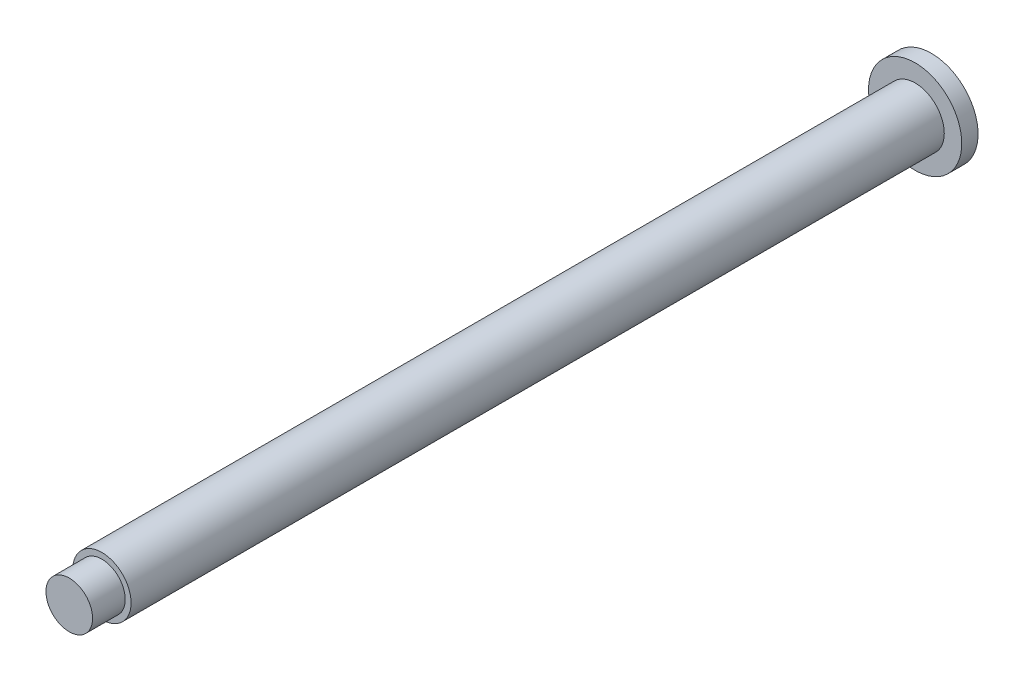
ISO-10303-21;
HEADER;
FILE_DESCRIPTION(('STEP AP214'),'2;1');
FILE_NAME('part.step','',(''),(''),'','','');
FILE_SCHEMA(('AUTOMOTIVE_DESIGN { 1 0 10303 214 1 1 1 1 }'));
ENDSEC;
DATA;
#1=APPLICATION_CONTEXT('core data for automotive mechanical design processes');
#2=APPLICATION_PROTOCOL_DEFINITION('international standard','automotive_design',2000,#1);
#3=PRODUCT_CONTEXT('',#1,'mechanical');
#4=PRODUCT('Part','Part','',(#3));
#5=PRODUCT_RELATED_PRODUCT_CATEGORY('part','',(#4));
#6=PRODUCT_DEFINITION_FORMATION('','',#4);
#7=PRODUCT_DEFINITION_CONTEXT('part definition',#1,'design');
#8=PRODUCT_DEFINITION('design','',#6,#7);
#9=PRODUCT_DEFINITION_SHAPE('','',#8);
#10=(LENGTH_UNIT() NAMED_UNIT(*) SI_UNIT(.MILLI.,.METRE.));
#11=(NAMED_UNIT(*) PLANE_ANGLE_UNIT() SI_UNIT($,.RADIAN.));
#12=(NAMED_UNIT(*) SI_UNIT($,.STERADIAN.) SOLID_ANGLE_UNIT());
#13=UNCERTAINTY_MEASURE_WITH_UNIT(LENGTH_MEASURE(1.E-05),#10,'distance_accuracy_value','');
#14=(GEOMETRIC_REPRESENTATION_CONTEXT(3) GLOBAL_UNCERTAINTY_ASSIGNED_CONTEXT((#13)) GLOBAL_UNIT_ASSIGNED_CONTEXT((#10,
#11,#12)) REPRESENTATION_CONTEXT('',''));
#15=CARTESIAN_POINT('',(0.,0.,0.));
#16=DIRECTION('',(0.,0.,1.));
#17=DIRECTION('',(1.,0.,0.));
#18=AXIS2_PLACEMENT_3D('',#15,#16,#17);
#19=CARTESIAN_POINT('',(0.,0.,69.75));
#20=DIRECTION('',(0.,0.,-1.));
#21=DIRECTION('',(-1.,0.,0.));
#22=AXIS2_PLACEMENT_3D('',#19,#20,#21);
#23=CYLINDRICAL_SURFACE('',#22,2.5);
#24=CARTESIAN_POINT('',(0.,0.,69.75));
#25=DIRECTION('',(0.,0.,1.));
#26=DIRECTION('',(1.,0.,0.));
#27=AXIS2_PLACEMENT_3D('',#24,#25,#26);
#28=CIRCLE('',#27,2.5);
#29=CARTESIAN_POINT('',(2.5,0.,69.75));
#30=VERTEX_POINT('',#29);
#31=EDGE_CURVE('E46',#30,#30,#28,.T.);
#32=ORIENTED_EDGE('',*,*,#31,.F.);
#33=EDGE_LOOP('',(#32));
#34=FACE_BOUND('',#33,.T.);
#35=CARTESIAN_POINT('',(0.,0.,0.));
#36=DIRECTION('',(0.,0.,1.));
#37=DIRECTION('',(1.,0.,0.));
#38=AXIS2_PLACEMENT_3D('',#35,#36,#37);
#39=CIRCLE('',#38,2.5);
#40=CARTESIAN_POINT('',(2.5,0.,0.));
#41=VERTEX_POINT('',#40);
#42=EDGE_CURVE('E42',#41,#41,#39,.T.);
#43=ORIENTED_EDGE('',*,*,#42,.T.);
#44=EDGE_LOOP('',(#43));
#45=FACE_BOUND('',#44,.T.);
#46=ADVANCED_FACE('F39',(#34,#45),#23,.T.);
#47=CARTESIAN_POINT('',(0.,0.,69.75));
#48=DIRECTION('',(0.,0.,1.));
#49=DIRECTION('',(1.,0.,0.));
#50=AXIS2_PLACEMENT_3D('',#47,#48,#49);
#51=PLANE('',#50);
#52=CARTESIAN_POINT('',(0.,0.,69.75));
#53=DIRECTION('',(0.,0.,1.));
#54=DIRECTION('',(1.,0.,0.));
#55=AXIS2_PLACEMENT_3D('',#52,#53,#54);
#56=CIRCLE('',#55,2.);
#57=CARTESIAN_POINT('',(2.,0.,69.75));
#58=VERTEX_POINT('',#57);
#59=EDGE_CURVE('E10',#58,#58,#56,.T.);
#60=ORIENTED_EDGE('',*,*,#59,.F.);
#61=EDGE_LOOP('',(#60));
#62=FACE_BOUND('',#61,.T.);
#63=ORIENTED_EDGE('',*,*,#31,.T.);
#64=EDGE_LOOP('',(#63));
#65=FACE_BOUND('',#64,.T.);
#66=ADVANCED_FACE('F88',(#62,#65),#51,.T.);
#67=CARTESIAN_POINT('',(0.,0.,-1.4));
#68=DIRECTION('',(0.,0.,1.));
#69=DIRECTION('',(1.,0.,0.));
#70=AXIS2_PLACEMENT_3D('',#67,#68,#69);
#71=CYLINDRICAL_SURFACE('',#70,4.);
#72=CARTESIAN_POINT('',(0.,0.,-1.4));
#73=DIRECTION('',(0.,0.,-1.));
#74=DIRECTION('',(-1.,0.,0.));
#75=AXIS2_PLACEMENT_3D('',#72,#73,#74);
#76=CIRCLE('',#75,4.);
#77=CARTESIAN_POINT('',(-4.,0.,-1.4));
#78=VERTEX_POINT('',#77);
#79=EDGE_CURVE('E61',#78,#78,#76,.T.);
#80=ORIENTED_EDGE('',*,*,#79,.F.);
#81=EDGE_LOOP('',(#80));
#82=FACE_BOUND('',#81,.T.);
#83=CARTESIAN_POINT('',(0.,0.,0.));
#84=DIRECTION('',(0.,0.,-1.));
#85=DIRECTION('',(-1.,0.,0.));
#86=AXIS2_PLACEMENT_3D('',#83,#84,#85);
#87=CIRCLE('',#86,4.);
#88=CARTESIAN_POINT('',(-4.,0.,0.));
#89=VERTEX_POINT('',#88);
#90=EDGE_CURVE('E57',#89,#89,#87,.T.);
#91=ORIENTED_EDGE('',*,*,#90,.T.);
#92=EDGE_LOOP('',(#91));
#93=FACE_BOUND('',#92,.T.);
#94=ADVANCED_FACE('F67',(#82,#93),#71,.T.);
#95=CARTESIAN_POINT('',(0.,0.,-1.4));
#96=DIRECTION('',(0.,0.,-1.));
#97=DIRECTION('',(-1.,0.,0.));
#98=AXIS2_PLACEMENT_3D('',#95,#96,#97);
#99=PLANE('',#98);
#100=CARTESIAN_POINT('',(0.,0.,-1.4));
#101=DIRECTION('',(0.,0.,-1.));
#102=DIRECTION('',(-1.,0.,0.));
#103=AXIS2_PLACEMENT_3D('',#100,#101,#102);
#104=CIRCLE('',#103,2.05);
#105=CARTESIAN_POINT('',(-2.05,0.,-1.4));
#106=VERTEX_POINT('',#105);
#107=EDGE_CURVE('E58',#106,#106,#104,.T.);
#108=ORIENTED_EDGE('',*,*,#107,.F.);
#109=EDGE_LOOP('',(#108));
#110=FACE_BOUND('',#109,.T.);
#111=ORIENTED_EDGE('',*,*,#79,.T.);
#112=EDGE_LOOP('',(#111));
#113=FACE_BOUND('',#112,.T.);
#114=ADVANCED_FACE('F72',(#110,#113),#99,.T.);
#115=CARTESIAN_POINT('',(0.,0.,0.));
#116=DIRECTION('',(0.,0.,-1.));
#117=DIRECTION('',(-1.,0.,0.));
#118=AXIS2_PLACEMENT_3D('',#115,#116,#117);
#119=PLANE('',#118);
#120=ORIENTED_EDGE('',*,*,#42,.F.);
#121=EDGE_LOOP('',(#120));
#122=FACE_BOUND('',#121,.T.);
#123=ORIENTED_EDGE('',*,*,#90,.F.);
#124=EDGE_LOOP('',(#123));
#125=FACE_BOUND('',#124,.T.);
#126=ADVANCED_FACE('F69',(#122,#125),#119,.F.);
#127=CARTESIAN_POINT('',(0.,0.,1.6));
#128=DIRECTION('',(0.,0.,-1.));
#129=DIRECTION('',(-1.,0.,0.));
#130=AXIS2_PLACEMENT_3D('',#127,#128,#129);
#131=CYLINDRICAL_SURFACE('',#130,2.05);
#132=CARTESIAN_POINT('',(0.,0.,1.6));
#133=DIRECTION('',(0.,0.,-1.));
#134=DIRECTION('',(-1.,0.,0.));
#135=AXIS2_PLACEMENT_3D('',#132,#133,#134);
#136=CIRCLE('',#135,2.05);
#137=CARTESIAN_POINT('',(-2.05,0.,1.6));
#138=VERTEX_POINT('',#137);
#139=EDGE_CURVE('E54',#138,#138,#136,.T.);
#140=ORIENTED_EDGE('',*,*,#139,.F.);
#141=EDGE_LOOP('',(#140));
#142=FACE_BOUND('',#141,.T.);
#143=ORIENTED_EDGE('',*,*,#107,.T.);
#144=EDGE_LOOP('',(#143));
#145=FACE_BOUND('',#144,.T.);
#146=ADVANCED_FACE('F71',(#142,#145),#131,.F.);
#147=CARTESIAN_POINT('',(0.,0.,1.6));
#148=DIRECTION('',(0.,0.,-1.));
#149=DIRECTION('',(-1.,0.,0.));
#150=AXIS2_PLACEMENT_3D('',#147,#148,#149);
#151=PLANE('',#150);
#152=ORIENTED_EDGE('',*,*,#139,.T.);
#153=EDGE_LOOP('',(#152));
#154=FACE_BOUND('',#153,.T.);
#155=ADVANCED_FACE('F80',(#154),#151,.T.);
#156=CARTESIAN_POINT('',(0.,0.,72.55));
#157=DIRECTION('',(0.,0.,-1.));
#158=DIRECTION('',(-1.,0.,0.));
#159=AXIS2_PLACEMENT_3D('',#156,#157,#158);
#160=CYLINDRICAL_SURFACE('',#159,2.);
#161=CARTESIAN_POINT('',(0.,0.,72.55));
#162=DIRECTION('',(0.,0.,1.));
#163=DIRECTION('',(1.,0.,0.));
#164=AXIS2_PLACEMENT_3D('',#161,#162,#163);
#165=CIRCLE('',#164,2.);
#166=CARTESIAN_POINT('',(2.,0.,72.55));
#167=VERTEX_POINT('',#166);
#168=EDGE_CURVE('E53',#167,#167,#165,.T.);
#169=ORIENTED_EDGE('',*,*,#168,.F.);
#170=EDGE_LOOP('',(#169));
#171=FACE_BOUND('',#170,.T.);
#172=ORIENTED_EDGE('',*,*,#59,.T.);
#173=EDGE_LOOP('',(#172));
#174=FACE_BOUND('',#173,.T.);
#175=ADVANCED_FACE('F135',(#171,#174),#160,.T.);
#176=CARTESIAN_POINT('',(0.,0.,72.55));
#177=DIRECTION('',(0.,0.,1.));
#178=DIRECTION('',(1.,0.,0.));
#179=AXIS2_PLACEMENT_3D('',#176,#177,#178);
#180=PLANE('',#179);
#181=ORIENTED_EDGE('',*,*,#168,.T.);
#182=EDGE_LOOP('',(#181));
#183=FACE_BOUND('',#182,.T.);
#184=ADVANCED_FACE('F144',(#183),#180,.T.);
#185=CLOSED_SHELL('',(#46,#66,#94,#114,#126,#146,#155,#175,#184));
#186=MANIFOLD_SOLID_BREP('B2',#185);
#187=ADVANCED_BREP_SHAPE_REPRESENTATION('',(#18,#186),#14);
#188=SHAPE_DEFINITION_REPRESENTATION(#9,#187);
ENDSEC;
END-ISO-10303-21;
